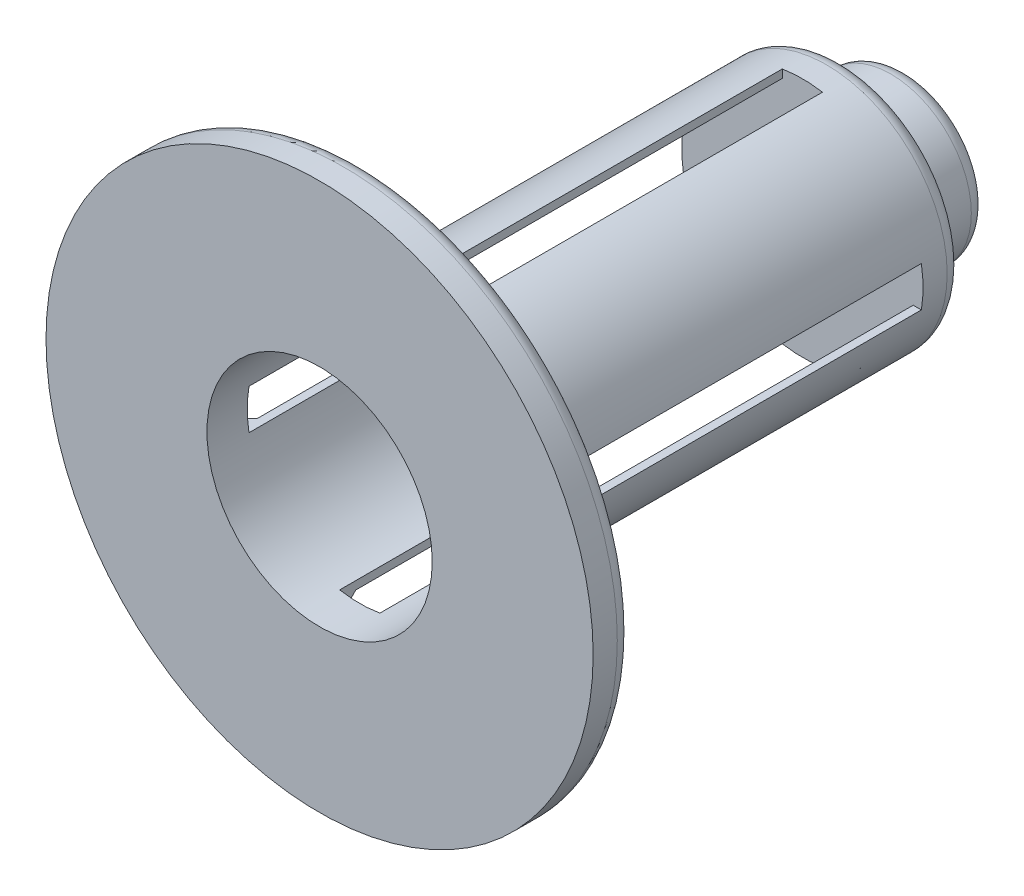
ISO-10303-21;
HEADER;
FILE_DESCRIPTION(('STEP AP214'),'2;1');
FILE_NAME('part.step','',(''),(''),'','','');
FILE_SCHEMA(('AUTOMOTIVE_DESIGN { 1 0 10303 214 1 1 1 1 }'));
ENDSEC;
DATA;
#1=APPLICATION_CONTEXT('core data for automotive mechanical design processes');
#2=APPLICATION_PROTOCOL_DEFINITION('international standard','automotive_design',2000,#1);
#3=PRODUCT_CONTEXT('',#1,'mechanical');
#4=PRODUCT('Part','Part','',(#3));
#5=PRODUCT_RELATED_PRODUCT_CATEGORY('part','',(#4));
#6=PRODUCT_DEFINITION_FORMATION('','',#4);
#7=PRODUCT_DEFINITION_CONTEXT('part definition',#1,'design');
#8=PRODUCT_DEFINITION('design','',#6,#7);
#9=PRODUCT_DEFINITION_SHAPE('','',#8);
#10=(LENGTH_UNIT() NAMED_UNIT(*) SI_UNIT(.MILLI.,.METRE.));
#11=(NAMED_UNIT(*) PLANE_ANGLE_UNIT() SI_UNIT($,.RADIAN.));
#12=(NAMED_UNIT(*) SI_UNIT($,.STERADIAN.) SOLID_ANGLE_UNIT());
#13=UNCERTAINTY_MEASURE_WITH_UNIT(LENGTH_MEASURE(1.E-05),#10,'distance_accuracy_value','');
#14=(GEOMETRIC_REPRESENTATION_CONTEXT(3) GLOBAL_UNCERTAINTY_ASSIGNED_CONTEXT((#13)) GLOBAL_UNIT_ASSIGNED_CONTEXT((#10,
#11,#12)) REPRESENTATION_CONTEXT('',''));
#15=CARTESIAN_POINT('',(0.,0.,0.));
#16=DIRECTION('',(0.,0.,1.));
#17=DIRECTION('',(1.,0.,0.));
#18=AXIS2_PLACEMENT_3D('',#15,#16,#17);
#19=CARTESIAN_POINT('',(0.,0.,0.));
#20=DIRECTION('',(0.,0.,1.));
#21=DIRECTION('',(1.,0.,0.));
#22=AXIS2_PLACEMENT_3D('',#19,#20,#21);
#23=PLANE('',#22);
#24=CARTESIAN_POINT('',(0.,0.,0.));
#25=DIRECTION('',(0.,0.,1.));
#26=DIRECTION('',(1.,0.,0.));
#27=AXIS2_PLACEMENT_3D('',#24,#25,#26);
#28=CIRCLE('',#27,16.51);
#29=CARTESIAN_POINT('',(16.51,0.,0.));
#30=VERTEX_POINT('',#29);
#31=EDGE_CURVE('E327',#30,#30,#28,.F.);
#32=ORIENTED_EDGE('',*,*,#31,.T.);
#33=EDGE_LOOP('',(#32));
#34=FACE_BOUND('',#33,.T.);
#35=CARTESIAN_POINT('',(0.,0.,0.));
#36=DIRECTION('',(0.,0.,1.));
#37=DIRECTION('',(1.,0.,0.));
#38=AXIS2_PLACEMENT_3D('',#35,#36,#37);
#39=CIRCLE('',#38,12.7);
#40=CARTESIAN_POINT('',(12.7,0.,0.));
#41=VERTEX_POINT('',#40);
#42=EDGE_CURVE('E307',#41,#41,#39,.F.);
#43=ORIENTED_EDGE('',*,*,#42,.F.);
#44=EDGE_LOOP('',(#43));
#45=FACE_BOUND('',#44,.T.);
#46=ADVANCED_FACE('F37',(#34,#45),#23,.F.);
#47=CARTESIAN_POINT('',(0.,0.,76.2));
#48=DIRECTION('',(0.,0.,-1.));
#49=DIRECTION('',(-1.,0.,0.));
#50=AXIS2_PLACEMENT_3D('',#47,#48,#49);
#51=CYLINDRICAL_SURFACE('',#50,19.05);
#52=CARTESIAN_POINT('',(0.,0.,2.54));
#53=DIRECTION('',(0.,0.,1.));
#54=DIRECTION('',(1.,0.,0.));
#55=AXIS2_PLACEMENT_3D('',#52,#53,#54);
#56=CIRCLE('',#55,19.05);
#57=CARTESIAN_POINT('',(19.05,0.,2.54));
#58=VERTEX_POINT('',#57);
#59=EDGE_CURVE('E324',#58,#58,#56,.T.);
#60=ORIENTED_EDGE('',*,*,#59,.T.);
#61=EDGE_LOOP('',(#60));
#62=FACE_BOUND('',#61,.T.);
#63=DIRECTION('',(0.,0.,1.));
#64=VECTOR('',#63,1.);
#65=CARTESIAN_POINT('',(-18.7835533113413,3.175,-6.53780909094287));
#66=LINE('',#65,#64);
#67=CARTESIAN_POINT('',(-18.7835533113413,3.175,6.35));
#68=VERTEX_POINT('',#67);
#69=CARTESIAN_POINT('',(-18.7835533113413,3.175,73.6600000000001));
#70=VERTEX_POINT('',#69);
#71=EDGE_CURVE('E285',#68,#70,#66,.T.);
#72=ORIENTED_EDGE('',*,*,#71,.T.);
#73=CARTESIAN_POINT('',(0.,0.,73.6600000000001));
#74=DIRECTION('',(0.,0.,1.));
#75=DIRECTION('',(1.,0.,0.));
#76=AXIS2_PLACEMENT_3D('',#73,#74,#75);
#77=CIRCLE('',#76,19.05);
#78=CARTESIAN_POINT('',(-3.175,18.7835533113413,73.6600000000001));
#79=VERTEX_POINT('',#78);
#80=EDGE_CURVE('E342',#70,#79,#77,.F.);
#81=ORIENTED_EDGE('',*,*,#80,.T.);
#82=DIRECTION('',(0.,0.,1.));
#83=VECTOR('',#82,1.);
#84=CARTESIAN_POINT('',(-3.175,18.7835533113413,-6.53780909094287));
#85=LINE('',#84,#83);
#86=CARTESIAN_POINT('',(-3.175,18.7835533113413,6.35));
#87=VERTEX_POINT('',#86);
#88=EDGE_CURVE('E254',#87,#79,#85,.T.);
#89=ORIENTED_EDGE('',*,*,#88,.F.);
#90=CARTESIAN_POINT('',(0.,0.,6.35));
#91=DIRECTION('',(0.,0.,1.));
#92=DIRECTION('',(1.,0.,0.));
#93=AXIS2_PLACEMENT_3D('',#90,#91,#92);
#94=CIRCLE('',#93,19.05);
#95=CARTESIAN_POINT('',(3.175,18.7835533113413,6.35));
#96=VERTEX_POINT('',#95);
#97=EDGE_CURVE('E249',#87,#96,#94,.F.);
#98=ORIENTED_EDGE('',*,*,#97,.T.);
#99=DIRECTION('',(0.,0.,1.));
#100=VECTOR('',#99,1.);
#101=CARTESIAN_POINT('',(3.175,18.7835533113413,-6.53780909094287));
#102=LINE('',#101,#100);
#103=CARTESIAN_POINT('',(3.175,18.7835533113413,73.6600000000001));
#104=VERTEX_POINT('',#103);
#105=EDGE_CURVE('E251',#96,#104,#102,.T.);
#106=ORIENTED_EDGE('',*,*,#105,.T.);
#107=CARTESIAN_POINT('',(0.,0.,73.6600000000001));
#108=DIRECTION('',(0.,0.,1.));
#109=DIRECTION('',(1.,0.,0.));
#110=AXIS2_PLACEMENT_3D('',#107,#108,#109);
#111=CIRCLE('',#110,19.05);
#112=CARTESIAN_POINT('',(18.7835533113413,3.175,73.6600000000001));
#113=VERTEX_POINT('',#112);
#114=EDGE_CURVE('E65',#104,#113,#111,.F.);
#115=ORIENTED_EDGE('',*,*,#114,.T.);
#116=DIRECTION('',(0.,0.,1.));
#117=VECTOR('',#116,1.);
#118=CARTESIAN_POINT('',(18.7835533113413,3.175,-6.53780909094287));
#119=LINE('',#118,#117);
#120=CARTESIAN_POINT('',(18.7835533113413,3.175,6.35));
#121=VERTEX_POINT('',#120);
#122=EDGE_CURVE('E275',#121,#113,#119,.T.);
#123=ORIENTED_EDGE('',*,*,#122,.F.);
#124=CARTESIAN_POINT('',(0.,0.,6.35));
#125=DIRECTION('',(0.,0.,1.));
#126=DIRECTION('',(1.,0.,0.));
#127=AXIS2_PLACEMENT_3D('',#124,#125,#126);
#128=CIRCLE('',#127,19.05);
#129=CARTESIAN_POINT('',(18.7835533113413,-3.175,6.35));
#130=VERTEX_POINT('',#129);
#131=EDGE_CURVE('E261',#121,#130,#128,.F.);
#132=ORIENTED_EDGE('',*,*,#131,.T.);
#133=DIRECTION('',(0.,0.,1.));
#134=VECTOR('',#133,1.);
#135=CARTESIAN_POINT('',(18.7835533113413,-3.175,-6.53780909094287));
#136=LINE('',#135,#134);
#137=CARTESIAN_POINT('',(18.7835533113413,-3.175,73.6600000000001));
#138=VERTEX_POINT('',#137);
#139=EDGE_CURVE('E277',#130,#138,#136,.T.);
#140=ORIENTED_EDGE('',*,*,#139,.T.);
#141=CARTESIAN_POINT('',(0.,0.,73.6600000000001));
#142=DIRECTION('',(0.,0.,1.));
#143=DIRECTION('',(1.,0.,0.));
#144=AXIS2_PLACEMENT_3D('',#141,#142,#143);
#145=CIRCLE('',#144,19.05);
#146=CARTESIAN_POINT('',(3.175,-18.7835533113413,73.6600000000001));
#147=VERTEX_POINT('',#146);
#148=EDGE_CURVE('E338',#138,#147,#145,.F.);
#149=ORIENTED_EDGE('',*,*,#148,.T.);
#150=DIRECTION('',(0.,0.,1.));
#151=VECTOR('',#150,1.);
#152=CARTESIAN_POINT('',(3.175,-18.7835533113413,-6.53780909094287));
#153=LINE('',#152,#151);
#154=CARTESIAN_POINT('',(3.175,-18.7835533113413,6.35));
#155=VERTEX_POINT('',#154);
#156=EDGE_CURVE('E243',#155,#147,#153,.T.);
#157=ORIENTED_EDGE('',*,*,#156,.F.);
#158=CARTESIAN_POINT('',(0.,0.,6.35));
#159=DIRECTION('',(0.,0.,1.));
#160=DIRECTION('',(1.,0.,0.));
#161=AXIS2_PLACEMENT_3D('',#158,#159,#160);
#162=CIRCLE('',#161,19.05);
#163=CARTESIAN_POINT('',(-3.175,-18.7835533113413,6.35));
#164=VERTEX_POINT('',#163);
#165=EDGE_CURVE('E473',#155,#164,#162,.F.);
#166=ORIENTED_EDGE('',*,*,#165,.T.);
#167=DIRECTION('',(0.,0.,1.));
#168=VECTOR('',#167,1.);
#169=CARTESIAN_POINT('',(-3.175,-18.7835533113413,-6.53780909094287));
#170=LINE('',#169,#168);
#171=CARTESIAN_POINT('',(-3.175,-18.7835533113413,73.6600000000001));
#172=VERTEX_POINT('',#171);
#173=EDGE_CURVE('E240',#164,#172,#170,.T.);
#174=ORIENTED_EDGE('',*,*,#173,.T.);
#175=CARTESIAN_POINT('',(0.,0.,73.6600000000001));
#176=DIRECTION('',(0.,0.,1.));
#177=DIRECTION('',(1.,0.,0.));
#178=AXIS2_PLACEMENT_3D('',#175,#176,#177);
#179=CIRCLE('',#178,19.05);
#180=CARTESIAN_POINT('',(-18.7835533113413,-3.175,73.6600000000001));
#181=VERTEX_POINT('',#180);
#182=EDGE_CURVE('E340',#172,#181,#179,.F.);
#183=ORIENTED_EDGE('',*,*,#182,.T.);
#184=DIRECTION('',(0.,0.,1.));
#185=VECTOR('',#184,1.);
#186=CARTESIAN_POINT('',(-18.7835533113413,-3.175,-6.53780909094287));
#187=LINE('',#186,#185);
#188=CARTESIAN_POINT('',(-18.7835533113413,-3.175,6.35));
#189=VERTEX_POINT('',#188);
#190=EDGE_CURVE('E293',#189,#181,#187,.T.);
#191=ORIENTED_EDGE('',*,*,#190,.F.);
#192=CARTESIAN_POINT('',(0.,0.,6.35));
#193=DIRECTION('',(0.,0.,1.));
#194=DIRECTION('',(1.,0.,0.));
#195=AXIS2_PLACEMENT_3D('',#192,#193,#194);
#196=CIRCLE('',#195,19.05);
#197=EDGE_CURVE('E284',#189,#68,#196,.F.);
#198=ORIENTED_EDGE('',*,*,#197,.T.);
#199=EDGE_LOOP('',(#72,#81,#89,#98,#106,#115,#123,#132,#140,#149,#157,#166,#174,#183,#191,#198));
#200=FACE_BOUND('',#199,.T.);
#201=ADVANCED_FACE('F431',(#62,#200),#51,.T.);
#202=CARTESIAN_POINT('',(0.,0.,-50.2894342779873));
#203=DIRECTION('',(0.,0.,1.));
#204=DIRECTION('',(1.,0.,0.));
#205=AXIS2_PLACEMENT_3D('',#202,#203,#204);
#206=CYLINDRICAL_SURFACE('',#205,17.78);
#207=DIRECTION('',(0.,0.,1.));
#208=VECTOR('',#207,1.);
#209=CARTESIAN_POINT('',(-17.494221188724,-3.175,-6.53780909094287));
#210=LINE('',#209,#208);
#211=CARTESIAN_POINT('',(-17.494221188724,-3.175,6.35));
#212=VERTEX_POINT('',#211);
#213=CARTESIAN_POINT('',(-17.494221188724,-3.175,76.2));
#214=VERTEX_POINT('',#213);
#215=EDGE_CURVE('E299',#212,#214,#210,.T.);
#216=ORIENTED_EDGE('',*,*,#215,.T.);
#217=CARTESIAN_POINT('',(0.,0.,76.2));
#218=DIRECTION('',(0.,0.,1.));
#219=DIRECTION('',(1.,0.,0.));
#220=AXIS2_PLACEMENT_3D('',#217,#218,#219);
#221=CIRCLE('',#220,17.78);
#222=CARTESIAN_POINT('',(-17.494221188724,3.175,76.2));
#223=VERTEX_POINT('',#222);
#224=EDGE_CURVE('E210',#223,#214,#221,.T.);
#225=ORIENTED_EDGE('',*,*,#224,.F.);
#226=DIRECTION('',(0.,0.,1.));
#227=VECTOR('',#226,1.);
#228=CARTESIAN_POINT('',(-17.494221188724,3.175,-6.53780909094287));
#229=LINE('',#228,#227);
#230=CARTESIAN_POINT('',(-17.494221188724,3.175,6.35));
#231=VERTEX_POINT('',#230);
#232=EDGE_CURVE('E296',#231,#223,#229,.T.);
#233=ORIENTED_EDGE('',*,*,#232,.F.);
#234=CARTESIAN_POINT('',(0.,0.,6.35));
#235=DIRECTION('',(0.,0.,1.));
#236=DIRECTION('',(1.,0.,0.));
#237=AXIS2_PLACEMENT_3D('',#234,#235,#236);
#238=CIRCLE('',#237,17.78);
#239=CARTESIAN_POINT('',(-3.175,17.494221188724,6.35));
#240=VERTEX_POINT('',#239);
#241=EDGE_CURVE('E305',#231,#240,#238,.F.);
#242=ORIENTED_EDGE('',*,*,#241,.T.);
#243=DIRECTION('',(0.,0.,1.));
#244=VECTOR('',#243,1.);
#245=CARTESIAN_POINT('',(-3.175,17.494221188724,-6.53780909094287));
#246=LINE('',#245,#244);
#247=CARTESIAN_POINT('',(-3.175,17.494221188724,76.2));
#248=VERTEX_POINT('',#247);
#249=EDGE_CURVE('E191',#240,#248,#246,.T.);
#250=ORIENTED_EDGE('',*,*,#249,.T.);
#251=CARTESIAN_POINT('',(3.175,17.494221188724,76.2));
#252=VERTEX_POINT('',#251);
#253=EDGE_CURVE('E197',#252,#248,#221,.T.);
#254=ORIENTED_EDGE('',*,*,#253,.F.);
#255=DIRECTION('',(0.,0.,1.));
#256=VECTOR('',#255,1.);
#257=CARTESIAN_POINT('',(3.175,17.494221188724,-6.53780909094287));
#258=LINE('',#257,#256);
#259=CARTESIAN_POINT('',(3.175,17.494221188724,6.35));
#260=VERTEX_POINT('',#259);
#261=EDGE_CURVE('E180',#260,#252,#258,.T.);
#262=ORIENTED_EDGE('',*,*,#261,.F.);
#263=CARTESIAN_POINT('',(17.494221188724,3.175,6.35));
#264=VERTEX_POINT('',#263);
#265=EDGE_CURVE('E308',#260,#264,#238,.F.);
#266=ORIENTED_EDGE('',*,*,#265,.T.);
#267=DIRECTION('',(0.,0.,1.));
#268=VECTOR('',#267,1.);
#269=CARTESIAN_POINT('',(17.494221188724,3.175,-6.53780909094287));
#270=LINE('',#269,#268);
#271=CARTESIAN_POINT('',(17.494221188724,3.175,76.2));
#272=VERTEX_POINT('',#271);
#273=EDGE_CURVE('E265',#264,#272,#270,.T.);
#274=ORIENTED_EDGE('',*,*,#273,.T.);
#275=CARTESIAN_POINT('',(17.494221188724,-3.175,76.2));
#276=VERTEX_POINT('',#275);
#277=EDGE_CURVE('E212',#276,#272,#221,.T.);
#278=ORIENTED_EDGE('',*,*,#277,.F.);
#279=DIRECTION('',(0.,0.,1.));
#280=VECTOR('',#279,1.);
#281=CARTESIAN_POINT('',(17.494221188724,-3.175,-6.53780909094287));
#282=LINE('',#281,#280);
#283=CARTESIAN_POINT('',(17.494221188724,-3.175,6.35));
#284=VERTEX_POINT('',#283);
#285=EDGE_CURVE('E272',#284,#276,#282,.T.);
#286=ORIENTED_EDGE('',*,*,#285,.F.);
#287=CARTESIAN_POINT('',(3.175,-17.494221188724,6.35));
#288=VERTEX_POINT('',#287);
#289=EDGE_CURVE('E309',#284,#288,#238,.F.);
#290=ORIENTED_EDGE('',*,*,#289,.T.);
#291=DIRECTION('',(0.,0.,1.));
#292=VECTOR('',#291,1.);
#293=CARTESIAN_POINT('',(3.175,-17.494221188724,-6.53780909094287));
#294=LINE('',#293,#292);
#295=CARTESIAN_POINT('',(3.175,-17.494221188724,76.2));
#296=VERTEX_POINT('',#295);
#297=EDGE_CURVE('E234',#288,#296,#294,.T.);
#298=ORIENTED_EDGE('',*,*,#297,.T.);
#299=CARTESIAN_POINT('',(-3.175,-17.494221188724,76.2));
#300=VERTEX_POINT('',#299);
#301=EDGE_CURVE('E216',#300,#296,#221,.T.);
#302=ORIENTED_EDGE('',*,*,#301,.F.);
#303=DIRECTION('',(0.,0.,1.));
#304=VECTOR('',#303,1.);
#305=CARTESIAN_POINT('',(-3.175,-17.494221188724,-6.53780909094287));
#306=LINE('',#305,#304);
#307=CARTESIAN_POINT('',(-3.175,-17.494221188724,6.35));
#308=VERTEX_POINT('',#307);
#309=EDGE_CURVE('E231',#308,#300,#306,.T.);
#310=ORIENTED_EDGE('',*,*,#309,.F.);
#311=EDGE_CURVE('E304',#308,#212,#238,.F.);
#312=ORIENTED_EDGE('',*,*,#311,.T.);
#313=EDGE_LOOP('',(#216,#225,#233,#242,#250,#254,#262,#266,#274,#278,#286,#290,#298,#302,#310,#312));
#314=FACE_BOUND('',#313,.T.);
#315=CARTESIAN_POINT('',(0.,0.,82.55));
#316=DIRECTION('',(0.,0.,1.));
#317=DIRECTION('',(1.,0.,0.));
#318=AXIS2_PLACEMENT_3D('',#315,#316,#317);
#319=CIRCLE('',#318,17.78);
#320=CARTESIAN_POINT('',(17.78,0.,82.55));
#321=VERTEX_POINT('',#320);
#322=EDGE_CURVE('E209',#321,#321,#319,.T.);
#323=ORIENTED_EDGE('',*,*,#322,.T.);
#324=EDGE_LOOP('',(#323));
#325=FACE_BOUND('',#324,.T.);
#326=ADVANCED_FACE('F206',(#314,#325),#206,.F.);
#327=CARTESIAN_POINT('',(0.,0.,6.35));
#328=DIRECTION('',(0.,0.,1.));
#329=DIRECTION('',(1.,0.,0.));
#330=AXIS2_PLACEMENT_3D('',#327,#328,#329);
#331=PLANE('',#330);
#332=ORIENTED_EDGE('',*,*,#241,.F.);
#333=DIRECTION('',(-1.,0.,0.));
#334=VECTOR('',#333,1.);
#335=CARTESIAN_POINT('',(0.,3.175,6.35));
#336=LINE('',#335,#334);
#337=EDGE_CURVE('E282',#231,#68,#336,.T.);
#338=ORIENTED_EDGE('',*,*,#337,.T.);
#339=ORIENTED_EDGE('',*,*,#197,.F.);
#340=DIRECTION('',(-1.,0.,0.));
#341=VECTOR('',#340,1.);
#342=CARTESIAN_POINT('',(0.,-3.175,6.35));
#343=LINE('',#342,#341);
#344=EDGE_CURVE('E288',#212,#189,#343,.T.);
#345=ORIENTED_EDGE('',*,*,#344,.F.);
#346=ORIENTED_EDGE('',*,*,#311,.F.);
#347=DIRECTION('',(0.,1.,0.));
#348=VECTOR('',#347,1.);
#349=CARTESIAN_POINT('',(-3.175,0.,6.35));
#350=LINE('',#349,#348);
#351=EDGE_CURVE('E239',#164,#308,#350,.T.);
#352=ORIENTED_EDGE('',*,*,#351,.F.);
#353=ORIENTED_EDGE('',*,*,#165,.F.);
#354=DIRECTION('',(0.,1.,0.));
#355=VECTOR('',#354,1.);
#356=CARTESIAN_POINT('',(3.175,0.,6.35));
#357=LINE('',#356,#355);
#358=EDGE_CURVE('E202',#155,#288,#357,.T.);
#359=ORIENTED_EDGE('',*,*,#358,.T.);
#360=ORIENTED_EDGE('',*,*,#289,.F.);
#361=DIRECTION('',(-1.,0.,0.));
#362=VECTOR('',#361,1.);
#363=CARTESIAN_POINT('',(0.,-3.175,6.35));
#364=LINE('',#363,#362);
#365=EDGE_CURVE('E268',#130,#284,#364,.T.);
#366=ORIENTED_EDGE('',*,*,#365,.F.);
#367=ORIENTED_EDGE('',*,*,#131,.F.);
#368=DIRECTION('',(-1.,0.,0.));
#369=VECTOR('',#368,1.);
#370=CARTESIAN_POINT('',(0.,3.175,6.35));
#371=LINE('',#370,#369);
#372=EDGE_CURVE('E264',#121,#264,#371,.T.);
#373=ORIENTED_EDGE('',*,*,#372,.T.);
#374=ORIENTED_EDGE('',*,*,#265,.F.);
#375=DIRECTION('',(0.,1.,0.));
#376=VECTOR('',#375,1.);
#377=CARTESIAN_POINT('',(3.175,0.,6.35));
#378=LINE('',#377,#376);
#379=EDGE_CURVE('E186',#260,#96,#378,.T.);
#380=ORIENTED_EDGE('',*,*,#379,.T.);
#381=ORIENTED_EDGE('',*,*,#97,.F.);
#382=DIRECTION('',(0.,1.,0.));
#383=VECTOR('',#382,1.);
#384=CARTESIAN_POINT('',(-3.175,0.,6.35));
#385=LINE('',#384,#383);
#386=EDGE_CURVE('E190',#240,#87,#385,.T.);
#387=ORIENTED_EDGE('',*,*,#386,.F.);
#388=EDGE_LOOP('',(#332,#338,#339,#345,#346,#352,#353,#359,#360,#366,#367,#373,#374,#380,#381,#387));
#389=FACE_BOUND('',#388,.T.);
#390=ADVANCED_FACE('F367',(#389),#331,.T.);
#391=CARTESIAN_POINT('',(0.,3.175,-6.53780909094287));
#392=DIRECTION('',(0.,-1.,0.));
#393=DIRECTION('',(0.,0.,-1.));
#394=AXIS2_PLACEMENT_3D('',#391,#392,#393);
#395=PLANE('',#394);
#396=ORIENTED_EDGE('',*,*,#232,.T.);
#397=DIRECTION('',(1.,0.,0.));
#398=VECTOR('',#397,1.);
#399=CARTESIAN_POINT('',(0.,3.175,76.2));
#400=LINE('',#399,#398);
#401=CARTESIAN_POINT('',(-21.3552680854162,3.175,76.2));
#402=VERTEX_POINT('',#401);
#403=EDGE_CURVE('E291',#402,#223,#400,.T.);
#404=ORIENTED_EDGE('',*,*,#403,.F.);
#405=CARTESIAN_POINT('',(-21.3552680854162,3.175,76.2));
#406=CARTESIAN_POINT('',(-20.9269813597421,3.175,75.7763301211556));
#407=CARTESIAN_POINT('',(-20.498528434465,3.175,75.3528285171043));
#408=CARTESIAN_POINT('',(-19.6412901764464,3.175,74.5061618504312));
#409=CARTESIAN_POINT('',(-19.2125048436985,3.175,74.0829967878159));
#410=CARTESIAN_POINT('',(-18.7835533113413,3.175,73.6600000000001));
#411=B_SPLINE_CURVE_WITH_KNOTS('',3,(#405,#406,#407,#408,#409,#410),.UNSPECIFIED.,.F.,.F.,(4,2,
4),(0.,1.80729899582581,3.61459802647382),.UNSPECIFIED.);
#412=EDGE_CURVE('E344',#402,#70,#411,.T.);
#413=ORIENTED_EDGE('',*,*,#412,.T.);
#414=ORIENTED_EDGE('',*,*,#71,.F.);
#415=ORIENTED_EDGE('',*,*,#337,.F.);
#416=EDGE_LOOP('',(#396,#404,#413,#414,#415));
#417=FACE_BOUND('',#416,.T.);
#418=ADVANCED_FACE('F361',(#417),#395,.T.);
#419=CARTESIAN_POINT('',(0.,-3.175,-6.53780909094287));
#420=DIRECTION('',(0.,-1.,0.));
#421=DIRECTION('',(0.,0.,-1.));
#422=AXIS2_PLACEMENT_3D('',#419,#420,#421);
#423=PLANE('',#422);
#424=ORIENTED_EDGE('',*,*,#344,.T.);
#425=ORIENTED_EDGE('',*,*,#190,.T.);
#426=CARTESIAN_POINT('',(-18.7835533113413,-3.175,73.6600000000001));
#427=CARTESIAN_POINT('',(-19.2125048436985,-3.175,74.0829967878158));
#428=CARTESIAN_POINT('',(-19.6412901764464,-3.175,74.5061618504311));
#429=CARTESIAN_POINT('',(-20.498528434465,-3.175,75.3528285171043));
#430=CARTESIAN_POINT('',(-20.9269813597421,-3.175,75.7763301211556));
#431=CARTESIAN_POINT('',(-21.3552680854162,-3.175,76.2));
#432=B_SPLINE_CURVE_WITH_KNOTS('',3,(#426,#427,#428,#429,#430,#431),.UNSPECIFIED.,.F.,.F.,(4,2,
4),(0.,1.80729903064804,3.61459802647387),.UNSPECIFIED.);
#433=CARTESIAN_POINT('',(-21.3552680854162,-3.175,76.2));
#434=VERTEX_POINT('',#433);
#435=EDGE_CURVE('E378',#181,#434,#432,.T.);
#436=ORIENTED_EDGE('',*,*,#435,.T.);
#437=DIRECTION('',(1.,0.,0.));
#438=VECTOR('',#437,1.);
#439=CARTESIAN_POINT('',(0.,-3.175,76.2));
#440=LINE('',#439,#438);
#441=EDGE_CURVE('E281',#434,#214,#440,.T.);
#442=ORIENTED_EDGE('',*,*,#441,.T.);
#443=ORIENTED_EDGE('',*,*,#215,.F.);
#444=EDGE_LOOP('',(#424,#425,#436,#442,#443));
#445=FACE_BOUND('',#444,.T.);
#446=ADVANCED_FACE('F366',(#445),#423,.F.);
#447=CARTESIAN_POINT('',(0.,3.175,-6.53780909094287));
#448=DIRECTION('',(0.,-1.,0.));
#449=DIRECTION('',(0.,0.,-1.));
#450=AXIS2_PLACEMENT_3D('',#447,#448,#449);
#451=PLANE('',#450);
#452=ORIENTED_EDGE('',*,*,#122,.T.);
#453=CARTESIAN_POINT('',(18.7835533113413,3.175,73.6600000000001));
#454=CARTESIAN_POINT('',(19.2125048436985,3.175,74.0829967878159));
#455=CARTESIAN_POINT('',(19.6412901764464,3.175,74.5061618504311));
#456=CARTESIAN_POINT('',(20.498528434465,3.175,75.3528285171043));
#457=CARTESIAN_POINT('',(20.9269813597421,3.175,75.7763301211556));
#458=CARTESIAN_POINT('',(21.3552680854162,3.175,76.2));
#459=B_SPLINE_CURVE_WITH_KNOTS('',3,(#453,#454,#455,#456,#457,#458),.UNSPECIFIED.,.F.,.F.,(4,2,
4),(0.,1.80729903064803,3.61459802647385),.UNSPECIFIED.);
#460=CARTESIAN_POINT('',(21.3552680854162,3.175,76.2));
#461=VERTEX_POINT('',#460);
#462=EDGE_CURVE('E12',#113,#461,#459,.T.);
#463=ORIENTED_EDGE('',*,*,#462,.T.);
#464=DIRECTION('',(1.,0.,0.));
#465=VECTOR('',#464,1.);
#466=CARTESIAN_POINT('',(0.,3.175,76.2));
#467=LINE('',#466,#465);
#468=EDGE_CURVE('E270',#272,#461,#467,.T.);
#469=ORIENTED_EDGE('',*,*,#468,.F.);
#470=ORIENTED_EDGE('',*,*,#273,.F.);
#471=ORIENTED_EDGE('',*,*,#372,.F.);
#472=EDGE_LOOP('',(#452,#463,#469,#470,#471));
#473=FACE_BOUND('',#472,.T.);
#474=ADVANCED_FACE('F374',(#473),#451,.T.);
#475=CARTESIAN_POINT('',(0.,-3.175,-6.53780909094287));
#476=DIRECTION('',(0.,-1.,0.));
#477=DIRECTION('',(0.,0.,-1.));
#478=AXIS2_PLACEMENT_3D('',#475,#476,#477);
#479=PLANE('',#478);
#480=ORIENTED_EDGE('',*,*,#365,.T.);
#481=ORIENTED_EDGE('',*,*,#285,.T.);
#482=DIRECTION('',(1.,0.,0.));
#483=VECTOR('',#482,1.);
#484=CARTESIAN_POINT('',(0.,-3.175,76.2));
#485=LINE('',#484,#483);
#486=CARTESIAN_POINT('',(21.3552680854162,-3.175,76.2));
#487=VERTEX_POINT('',#486);
#488=EDGE_CURVE('E260',#276,#487,#485,.T.);
#489=ORIENTED_EDGE('',*,*,#488,.T.);
#490=CARTESIAN_POINT('',(21.3552680854162,-3.175,76.2));
#491=CARTESIAN_POINT('',(20.9269813597421,-3.175,75.7763301211556));
#492=CARTESIAN_POINT('',(20.498528434465,-3.175,75.3528285171043));
#493=CARTESIAN_POINT('',(19.6412901764464,-3.175,74.5061618504312));
#494=CARTESIAN_POINT('',(19.2125048436985,-3.175,74.0829967878159));
#495=CARTESIAN_POINT('',(18.7835533113413,-3.175,73.6600000000001));
#496=B_SPLINE_CURVE_WITH_KNOTS('',3,(#490,#491,#492,#493,#494,#495),.UNSPECIFIED.,.F.,.F.,(4,2,
4),(0.,1.80729899582581,3.61459802647382),.UNSPECIFIED.);
#497=EDGE_CURVE('E57',#487,#138,#496,.T.);
#498=ORIENTED_EDGE('',*,*,#497,.T.);
#499=ORIENTED_EDGE('',*,*,#139,.F.);
#500=EDGE_LOOP('',(#480,#481,#489,#498,#499));
#501=FACE_BOUND('',#500,.T.);
#502=ADVANCED_FACE('F369',(#501),#479,.F.);
#503=CARTESIAN_POINT('',(3.175,0.,-6.53780909094287));
#504=DIRECTION('',(-1.,0.,0.));
#505=DIRECTION('',(0.,0.,1.));
#506=AXIS2_PLACEMENT_3D('',#503,#504,#505);
#507=PLANE('',#506);
#508=ORIENTED_EDGE('',*,*,#261,.T.);
#509=DIRECTION('',(0.,-1.,0.));
#510=VECTOR('',#509,1.);
#511=CARTESIAN_POINT('',(3.175,0.,76.2));
#512=LINE('',#511,#510);
#513=CARTESIAN_POINT('',(3.175,21.3552680854162,76.2));
#514=VERTEX_POINT('',#513);
#515=EDGE_CURVE('E183',#514,#252,#512,.T.);
#516=ORIENTED_EDGE('',*,*,#515,.F.);
#517=CARTESIAN_POINT('',(3.175,21.3552680854162,76.2));
#518=CARTESIAN_POINT('',(3.175,20.9269813597421,75.7763301211556));
#519=CARTESIAN_POINT('',(3.175,20.498528434465,75.3528285171043));
#520=CARTESIAN_POINT('',(3.175,19.6412901764464,74.5061618504311));
#521=CARTESIAN_POINT('',(3.175,19.2125048436985,74.0829967878159));
#522=CARTESIAN_POINT('',(3.175,18.7835533113413,73.6600000000001));
#523=B_SPLINE_CURVE_WITH_KNOTS('',3,(#517,#518,#519,#520,#521,#522),.UNSPECIFIED.,.F.,.F.,(4,2,
4),(0.,1.80729899582582,3.61459802647385),.UNSPECIFIED.);
#524=EDGE_CURVE('E50',#514,#104,#523,.T.);
#525=ORIENTED_EDGE('',*,*,#524,.T.);
#526=ORIENTED_EDGE('',*,*,#105,.F.);
#527=ORIENTED_EDGE('',*,*,#379,.F.);
#528=EDGE_LOOP('',(#508,#516,#525,#526,#527));
#529=FACE_BOUND('',#528,.T.);
#530=ADVANCED_FACE('F182',(#529),#507,.T.);
#531=CARTESIAN_POINT('',(-3.175,0.,-6.53780909094287));
#532=DIRECTION('',(-1.,0.,0.));
#533=DIRECTION('',(0.,0.,1.));
#534=AXIS2_PLACEMENT_3D('',#531,#532,#533);
#535=PLANE('',#534);
#536=ORIENTED_EDGE('',*,*,#386,.T.);
#537=ORIENTED_EDGE('',*,*,#88,.T.);
#538=CARTESIAN_POINT('',(-3.175,18.7835533113413,73.6600000000001));
#539=CARTESIAN_POINT('',(-3.175,19.2125048436985,74.0829967878159));
#540=CARTESIAN_POINT('',(-3.175,19.6412901764464,74.5061618504311));
#541=CARTESIAN_POINT('',(-3.175,20.498528434465,75.3528285171043));
#542=CARTESIAN_POINT('',(-3.175,20.9269813597421,75.7763301211556));
#543=CARTESIAN_POINT('',(-3.175,21.3552680854162,76.2));
#544=B_SPLINE_CURVE_WITH_KNOTS('',3,(#538,#539,#540,#541,#542,#543),.UNSPECIFIED.,.F.,.F.,(4,2,
4),(0.,1.80729903064801,3.61459802647383),.UNSPECIFIED.);
#545=CARTESIAN_POINT('',(-3.175,21.3552680854162,76.2));
#546=VERTEX_POINT('',#545);
#547=EDGE_CURVE('E351',#79,#546,#544,.T.);
#548=ORIENTED_EDGE('',*,*,#547,.T.);
#549=DIRECTION('',(0.,-1.,0.));
#550=VECTOR('',#549,1.);
#551=CARTESIAN_POINT('',(-3.175,0.,76.2));
#552=LINE('',#551,#550);
#553=EDGE_CURVE('E201',#546,#248,#552,.T.);
#554=ORIENTED_EDGE('',*,*,#553,.T.);
#555=ORIENTED_EDGE('',*,*,#249,.F.);
#556=EDGE_LOOP('',(#536,#537,#548,#554,#555));
#557=FACE_BOUND('',#556,.T.);
#558=ADVANCED_FACE('F415',(#557),#535,.F.);
#559=CARTESIAN_POINT('',(3.175,0.,-6.53780909094287));
#560=DIRECTION('',(-1.,0.,0.));
#561=DIRECTION('',(0.,0.,1.));
#562=AXIS2_PLACEMENT_3D('',#559,#560,#561);
#563=PLANE('',#562);
#564=ORIENTED_EDGE('',*,*,#156,.T.);
#565=CARTESIAN_POINT('',(3.175,-18.7835533113413,73.6600000000001));
#566=CARTESIAN_POINT('',(3.175,-19.2125048436985,74.0829967878159));
#567=CARTESIAN_POINT('',(3.175,-19.6412901764464,74.5061618504312));
#568=CARTESIAN_POINT('',(3.175,-20.498528434465,75.3528285171043));
#569=CARTESIAN_POINT('',(3.175,-20.9269813597421,75.7763301211556));
#570=CARTESIAN_POINT('',(3.175,-21.3552680854162,76.2));
#571=B_SPLINE_CURVE_WITH_KNOTS('',3,(#565,#566,#567,#568,#569,#570),.UNSPECIFIED.,.F.,.F.,(4,2,
4),(0.,1.80729903064802,3.61459802647383),.UNSPECIFIED.);
#572=CARTESIAN_POINT('',(3.175,-21.3552680854162,76.2));
#573=VERTEX_POINT('',#572);
#574=EDGE_CURVE('E403',#147,#573,#571,.T.);
#575=ORIENTED_EDGE('',*,*,#574,.T.);
#576=DIRECTION('',(0.,-1.,0.));
#577=VECTOR('',#576,1.);
#578=CARTESIAN_POINT('',(3.175,0.,76.2));
#579=LINE('',#578,#577);
#580=EDGE_CURVE('E224',#296,#573,#579,.T.);
#581=ORIENTED_EDGE('',*,*,#580,.F.);
#582=ORIENTED_EDGE('',*,*,#297,.F.);
#583=ORIENTED_EDGE('',*,*,#358,.F.);
#584=EDGE_LOOP('',(#564,#575,#581,#582,#583));
#585=FACE_BOUND('',#584,.T.);
#586=ADVANCED_FACE('F412',(#585),#563,.T.);
#587=CARTESIAN_POINT('',(-3.175,0.,-6.53780909094287));
#588=DIRECTION('',(-1.,0.,0.));
#589=DIRECTION('',(0.,0.,1.));
#590=AXIS2_PLACEMENT_3D('',#587,#588,#589);
#591=PLANE('',#590);
#592=ORIENTED_EDGE('',*,*,#351,.T.);
#593=ORIENTED_EDGE('',*,*,#309,.T.);
#594=DIRECTION('',(0.,-1.,0.));
#595=VECTOR('',#594,1.);
#596=CARTESIAN_POINT('',(-3.175,0.,76.2));
#597=LINE('',#596,#595);
#598=CARTESIAN_POINT('',(-3.175,-21.3552680854162,76.2));
#599=VERTEX_POINT('',#598);
#600=EDGE_CURVE('E227',#300,#599,#597,.T.);
#601=ORIENTED_EDGE('',*,*,#600,.T.);
#602=CARTESIAN_POINT('',(-3.175,-21.3552680854162,76.2));
#603=CARTESIAN_POINT('',(-3.175,-20.9269813597421,75.7763301211556));
#604=CARTESIAN_POINT('',(-3.175,-20.498528434465,75.3528285171043));
#605=CARTESIAN_POINT('',(-3.175,-19.6412901764464,74.5061618504311));
#606=CARTESIAN_POINT('',(-3.175,-19.2125048436985,74.0829967878158));
#607=CARTESIAN_POINT('',(-3.175,-18.7835533113413,73.6600000000001));
#608=B_SPLINE_CURVE_WITH_KNOTS('',3,(#602,#603,#604,#605,#606,#607),.UNSPECIFIED.,.F.,.F.,(4,2,
4),(0.,1.80729899582583,3.61459802647388),.UNSPECIFIED.);
#609=EDGE_CURVE('E384',#599,#172,#608,.T.);
#610=ORIENTED_EDGE('',*,*,#609,.T.);
#611=ORIENTED_EDGE('',*,*,#173,.F.);
#612=EDGE_LOOP('',(#592,#593,#601,#610,#611));
#613=FACE_BOUND('',#612,.T.);
#614=ADVANCED_FACE('F236',(#613),#591,.F.);
#615=CARTESIAN_POINT('',(0.,0.,76.2));
#616=DIRECTION('',(0.,0.,1.));
#617=DIRECTION('',(1.,0.,0.));
#618=AXIS2_PLACEMENT_3D('',#615,#616,#617);
#619=PLANE('',#618);
#620=CARTESIAN_POINT('',(0.,0.,76.2));
#621=DIRECTION('',(0.,0.,1.));
#622=DIRECTION('',(1.,0.,0.));
#623=AXIS2_PLACEMENT_3D('',#620,#621,#622);
#624=CIRCLE('',#623,40.64);
#625=CARTESIAN_POINT('',(40.64,0.,76.2));
#626=VERTEX_POINT('',#625);
#627=EDGE_CURVE('E315',#626,#626,#624,.F.);
#628=ORIENTED_EDGE('',*,*,#627,.T.);
#629=EDGE_LOOP('',(#628));
#630=FACE_BOUND('',#629,.T.);
#631=CARTESIAN_POINT('',(0.,0.,76.2));
#632=DIRECTION('',(0.,0.,1.));
#633=DIRECTION('',(1.,0.,0.));
#634=AXIS2_PLACEMENT_3D('',#631,#632,#633);
#635=CIRCLE('',#634,21.5899999999999);
#636=EDGE_CURVE('E335',#546,#402,#635,.T.);
#637=ORIENTED_EDGE('',*,*,#636,.T.);
#638=ORIENTED_EDGE('',*,*,#403,.T.);
#639=ORIENTED_EDGE('',*,*,#224,.T.);
#640=ORIENTED_EDGE('',*,*,#441,.F.);
#641=CARTESIAN_POINT('',(0.,0.,76.2));
#642=DIRECTION('',(0.,0.,1.));
#643=DIRECTION('',(1.,0.,0.));
#644=AXIS2_PLACEMENT_3D('',#641,#642,#643);
#645=CIRCLE('',#644,21.5899999999999);
#646=EDGE_CURVE('E333',#434,#599,#645,.T.);
#647=ORIENTED_EDGE('',*,*,#646,.T.);
#648=ORIENTED_EDGE('',*,*,#600,.F.);
#649=ORIENTED_EDGE('',*,*,#301,.T.);
#650=ORIENTED_EDGE('',*,*,#580,.T.);
#651=CARTESIAN_POINT('',(0.,0.,76.2));
#652=DIRECTION('',(0.,0.,1.));
#653=DIRECTION('',(1.,0.,0.));
#654=AXIS2_PLACEMENT_3D('',#651,#652,#653);
#655=CIRCLE('',#654,21.5899999999999);
#656=EDGE_CURVE('E331',#573,#487,#655,.T.);
#657=ORIENTED_EDGE('',*,*,#656,.T.);
#658=ORIENTED_EDGE('',*,*,#488,.F.);
#659=ORIENTED_EDGE('',*,*,#277,.T.);
#660=ORIENTED_EDGE('',*,*,#468,.T.);
#661=CARTESIAN_POINT('',(0.,0.,76.2));
#662=DIRECTION('',(0.,0.,1.));
#663=DIRECTION('',(1.,0.,0.));
#664=AXIS2_PLACEMENT_3D('',#661,#662,#663);
#665=CIRCLE('',#664,21.5899999999999);
#666=EDGE_CURVE('E200',#461,#514,#665,.T.);
#667=ORIENTED_EDGE('',*,*,#666,.T.);
#668=ORIENTED_EDGE('',*,*,#515,.T.);
#669=ORIENTED_EDGE('',*,*,#253,.T.);
#670=ORIENTED_EDGE('',*,*,#553,.F.);
#671=EDGE_LOOP('',(#637,#638,#639,#640,#647,#648,#649,#650,#657,#658,#659,#660,#667,#668,#669,#670));
#672=FACE_BOUND('',#671,.T.);
#673=ADVANCED_FACE('F196',(#630,#672),#619,.F.);
#674=CARTESIAN_POINT('',(0.,0.,82.55));
#675=DIRECTION('',(0.,0.,1.));
#676=DIRECTION('',(1.,0.,0.));
#677=AXIS2_PLACEMENT_3D('',#674,#675,#676);
#678=PLANE('',#677);
#679=CARTESIAN_POINT('',(0.,0.,82.55));
#680=DIRECTION('',(0.,0.,1.));
#681=DIRECTION('',(1.,0.,0.));
#682=AXIS2_PLACEMENT_3D('',#679,#680,#681);
#683=CIRCLE('',#682,43.18);
#684=CARTESIAN_POINT('',(43.18,0.,82.55));
#685=VERTEX_POINT('',#684);
#686=EDGE_CURVE('E214',#685,#685,#683,.T.);
#687=ORIENTED_EDGE('',*,*,#686,.T.);
#688=EDGE_LOOP('',(#687));
#689=FACE_BOUND('',#688,.T.);
#690=ORIENTED_EDGE('',*,*,#322,.F.);
#691=EDGE_LOOP('',(#690));
#692=FACE_BOUND('',#691,.T.);
#693=ADVANCED_FACE('F501',(#689,#692),#678,.T.);
#694=CARTESIAN_POINT('',(0.,0.,82.55));
#695=DIRECTION('',(0.,0.,-1.));
#696=DIRECTION('',(-1.,0.,0.));
#697=AXIS2_PLACEMENT_3D('',#694,#695,#696);
#698=CYLINDRICAL_SURFACE('',#697,43.18);
#699=CARTESIAN_POINT('',(0.,0.,78.74));
#700=DIRECTION('',(0.,0.,1.));
#701=DIRECTION('',(1.,0.,0.));
#702=AXIS2_PLACEMENT_3D('',#699,#700,#701);
#703=CIRCLE('',#702,43.18);
#704=CARTESIAN_POINT('',(43.18,0.,78.74));
#705=VERTEX_POINT('',#704);
#706=EDGE_CURVE('E312',#705,#705,#703,.T.);
#707=ORIENTED_EDGE('',*,*,#706,.T.);
#708=EDGE_LOOP('',(#707));
#709=FACE_BOUND('',#708,.T.);
#710=ORIENTED_EDGE('',*,*,#686,.F.);
#711=EDGE_LOOP('',(#710));
#712=FACE_BOUND('',#711,.T.);
#713=ADVANCED_FACE('F504',(#709,#712),#698,.T.);
#714=CARTESIAN_POINT('',(0.,0.,-10.16));
#715=DIRECTION('',(0.,0.,1.));
#716=DIRECTION('',(1.,0.,0.));
#717=AXIS2_PLACEMENT_3D('',#714,#715,#716);
#718=CYLINDRICAL_SURFACE('',#717,12.7);
#719=CARTESIAN_POINT('',(0.,0.,-7.62));
#720=DIRECTION('',(0.,0.,-1.));
#721=DIRECTION('',(-1.,0.,0.));
#722=AXIS2_PLACEMENT_3D('',#719,#720,#721);
#723=CIRCLE('',#722,12.7);
#724=CARTESIAN_POINT('',(-12.7,0.,-7.62));
#725=VERTEX_POINT('',#724);
#726=EDGE_CURVE('E321',#725,#725,#723,.F.);
#727=ORIENTED_EDGE('',*,*,#726,.T.);
#728=EDGE_LOOP('',(#727));
#729=FACE_BOUND('',#728,.T.);
#730=ORIENTED_EDGE('',*,*,#42,.T.);
#731=EDGE_LOOP('',(#730));
#732=FACE_BOUND('',#731,.T.);
#733=ADVANCED_FACE('F506',(#729,#732),#718,.T.);
#734=CARTESIAN_POINT('',(0.,0.,-10.16));
#735=DIRECTION('',(0.,0.,-1.));
#736=DIRECTION('',(-1.,0.,0.));
#737=AXIS2_PLACEMENT_3D('',#734,#735,#736);
#738=PLANE('',#737);
#739=CARTESIAN_POINT('',(0.,0.,-10.16));
#740=DIRECTION('',(0.,0.,-1.));
#741=DIRECTION('',(-1.,0.,0.));
#742=AXIS2_PLACEMENT_3D('',#739,#740,#741);
#743=CIRCLE('',#742,10.16);
#744=CARTESIAN_POINT('',(-10.16,0.,-10.16));
#745=VERTEX_POINT('',#744);
#746=EDGE_CURVE('E318',#745,#745,#743,.T.);
#747=ORIENTED_EDGE('',*,*,#746,.T.);
#748=EDGE_LOOP('',(#747));
#749=FACE_BOUND('',#748,.T.);
#750=ADVANCED_FACE('F445',(#749),#738,.T.);
#751=CARTESIAN_POINT('',(0.,0.,78.74));
#752=DIRECTION('',(0.,0.,1.));
#753=DIRECTION('',(1.,0.,0.));
#754=AXIS2_PLACEMENT_3D('',#751,#752,#753);
#755=TOROIDAL_SURFACE('',#754,40.64,2.54);
#756=ORIENTED_EDGE('',*,*,#627,.F.);
#757=EDGE_LOOP('',(#756));
#758=FACE_BOUND('',#757,.T.);
#759=ORIENTED_EDGE('',*,*,#706,.F.);
#760=EDGE_LOOP('',(#759));
#761=FACE_BOUND('',#760,.T.);
#762=ADVANCED_FACE('F441',(#758,#761),#755,.T.);
#763=CARTESIAN_POINT('',(0.,0.,-7.62));
#764=DIRECTION('',(0.,0.,-1.));
#765=DIRECTION('',(-1.,0.,0.));
#766=AXIS2_PLACEMENT_3D('',#763,#764,#765);
#767=TOROIDAL_SURFACE('',#766,10.16,2.54);
#768=ORIENTED_EDGE('',*,*,#726,.F.);
#769=EDGE_LOOP('',(#768));
#770=FACE_BOUND('',#769,.T.);
#771=ORIENTED_EDGE('',*,*,#746,.F.);
#772=EDGE_LOOP('',(#771));
#773=FACE_BOUND('',#772,.T.);
#774=ADVANCED_FACE('F444',(#770,#773),#767,.T.);
#775=CARTESIAN_POINT('',(0.,0.,2.54));
#776=DIRECTION('',(0.,0.,1.));
#777=DIRECTION('',(1.,0.,0.));
#778=AXIS2_PLACEMENT_3D('',#775,#776,#777);
#779=TOROIDAL_SURFACE('',#778,16.51,2.54);
#780=ORIENTED_EDGE('',*,*,#31,.F.);
#781=EDGE_LOOP('',(#780));
#782=FACE_BOUND('',#781,.T.);
#783=ORIENTED_EDGE('',*,*,#59,.F.);
#784=EDGE_LOOP('',(#783));
#785=FACE_BOUND('',#784,.T.);
#786=ADVANCED_FACE('F448',(#782,#785),#779,.T.);
#787=CARTESIAN_POINT('',(0.,0.,76.2));
#788=DIRECTION('',(0.,0.,1.));
#789=DIRECTION('',(1.,0.,0.));
#790=AXIS2_PLACEMENT_3D('',#787,#788,#789);
#791=CONICAL_SURFACE('',#790,21.5899999999999,0.785398163397452);
#792=ORIENTED_EDGE('',*,*,#547,.F.);
#793=ORIENTED_EDGE('',*,*,#80,.F.);
#794=ORIENTED_EDGE('',*,*,#412,.F.);
#795=ORIENTED_EDGE('',*,*,#636,.F.);
#796=EDGE_LOOP('',(#792,#793,#794,#795));
#797=FACE_BOUND('',#796,.T.);
#798=ADVANCED_FACE('F357',(#797),#791,.T.);
#799=CARTESIAN_POINT('',(0.,0.,76.2));
#800=DIRECTION('',(0.,0.,1.));
#801=DIRECTION('',(1.,0.,0.));
#802=AXIS2_PLACEMENT_3D('',#799,#800,#801);
#803=CONICAL_SURFACE('',#802,21.5899999999999,0.785398163397454);
#804=ORIENTED_EDGE('',*,*,#435,.F.);
#805=ORIENTED_EDGE('',*,*,#182,.F.);
#806=ORIENTED_EDGE('',*,*,#609,.F.);
#807=ORIENTED_EDGE('',*,*,#646,.F.);
#808=EDGE_LOOP('',(#804,#805,#806,#807));
#809=FACE_BOUND('',#808,.T.);
#810=ADVANCED_FACE('F393',(#809),#803,.T.);
#811=CARTESIAN_POINT('',(0.,0.,76.2));
#812=DIRECTION('',(0.,0.,1.));
#813=DIRECTION('',(1.,0.,0.));
#814=AXIS2_PLACEMENT_3D('',#811,#812,#813);
#815=CONICAL_SURFACE('',#814,21.5899999999999,0.785398163397452);
#816=ORIENTED_EDGE('',*,*,#574,.F.);
#817=ORIENTED_EDGE('',*,*,#148,.F.);
#818=ORIENTED_EDGE('',*,*,#497,.F.);
#819=ORIENTED_EDGE('',*,*,#656,.F.);
#820=EDGE_LOOP('',(#816,#817,#818,#819));
#821=FACE_BOUND('',#820,.T.);
#822=ADVANCED_FACE('F396',(#821),#815,.T.);
#823=CARTESIAN_POINT('',(0.,0.,76.2));
#824=DIRECTION('',(0.,0.,1.));
#825=DIRECTION('',(1.,0.,0.));
#826=AXIS2_PLACEMENT_3D('',#823,#824,#825);
#827=CONICAL_SURFACE('',#826,21.5899999999999,0.785398163397454);
#828=ORIENTED_EDGE('',*,*,#462,.F.);
#829=ORIENTED_EDGE('',*,*,#114,.F.);
#830=ORIENTED_EDGE('',*,*,#524,.F.);
#831=ORIENTED_EDGE('',*,*,#666,.F.);
#832=EDGE_LOOP('',(#828,#829,#830,#831));
#833=FACE_BOUND('',#832,.T.);
#834=ADVANCED_FACE('F39',(#833),#827,.T.);
#835=CLOSED_SHELL('',(#46,#201,#326,#390,#418,#446,#474,#502,#530,#558,#586,#614,#673,#693,#713,
#733,#750,#762,#774,#786,#798,#810,#822,#834));
#836=MANIFOLD_SOLID_BREP('B2',#835);
#837=ADVANCED_BREP_SHAPE_REPRESENTATION('',(#18,#836),#14);
#838=SHAPE_DEFINITION_REPRESENTATION(#9,#837);
ENDSEC;
END-ISO-10303-21;
